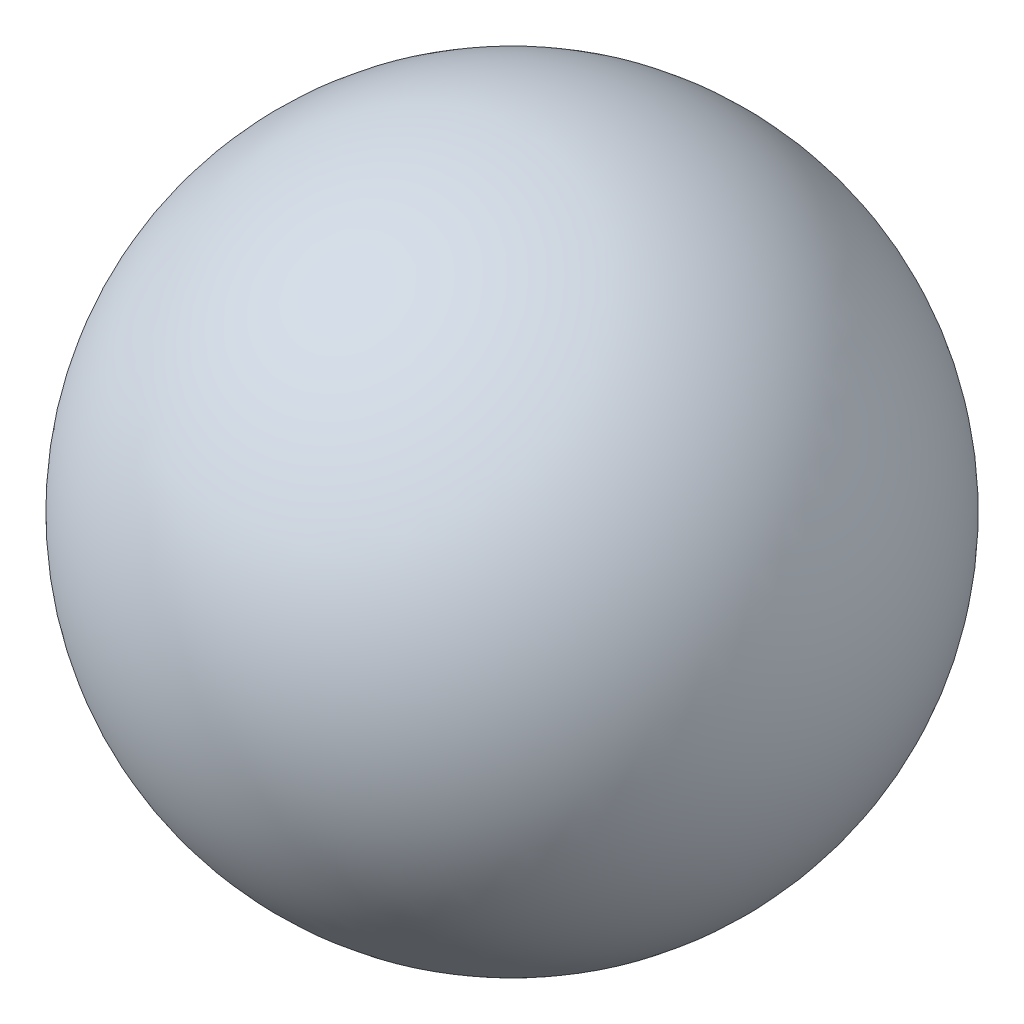
ISO-10303-21;
HEADER;
FILE_DESCRIPTION(('STEP AP214'),'2;1');
FILE_NAME('part.step','',(''),(''),'','','');
FILE_SCHEMA(('AUTOMOTIVE_DESIGN { 1 0 10303 214 1 1 1 1 }'));
ENDSEC;
DATA;
#1=APPLICATION_CONTEXT('core data for automotive mechanical design processes');
#2=APPLICATION_PROTOCOL_DEFINITION('international standard','automotive_design',2000,#1);
#3=PRODUCT_CONTEXT('',#1,'mechanical');
#4=PRODUCT('Part','Part','',(#3));
#5=PRODUCT_RELATED_PRODUCT_CATEGORY('part','',(#4));
#6=PRODUCT_DEFINITION_FORMATION('','',#4);
#7=PRODUCT_DEFINITION_CONTEXT('part definition',#1,'design');
#8=PRODUCT_DEFINITION('design','',#6,#7);
#9=PRODUCT_DEFINITION_SHAPE('','',#8);
#10=(LENGTH_UNIT() NAMED_UNIT(*) SI_UNIT(.MILLI.,.METRE.));
#11=(NAMED_UNIT(*) PLANE_ANGLE_UNIT() SI_UNIT($,.RADIAN.));
#12=(NAMED_UNIT(*) SI_UNIT($,.STERADIAN.) SOLID_ANGLE_UNIT());
#13=UNCERTAINTY_MEASURE_WITH_UNIT(LENGTH_MEASURE(1.E-05),#10,'distance_accuracy_value','');
#14=(GEOMETRIC_REPRESENTATION_CONTEXT(3) GLOBAL_UNCERTAINTY_ASSIGNED_CONTEXT((#13)) GLOBAL_UNIT_ASSIGNED_CONTEXT((#10,
#11,#12)) REPRESENTATION_CONTEXT('',''));
#15=CARTESIAN_POINT('',(0.,0.,0.));
#16=DIRECTION('',(0.,0.,1.));
#17=DIRECTION('',(1.,0.,0.));
#18=AXIS2_PLACEMENT_3D('',#15,#16,#17);
#19=CARTESIAN_POINT('',(0.,0.,0.));
#20=DIRECTION('',(0.,1.,0.));
#21=DIRECTION('',(1.,0.,0.));
#22=AXIS2_PLACEMENT_3D('',#19,#20,#21);
#23=SPHERICAL_SURFACE('',#22,2.75);
#24=CARTESIAN_POINT('',(0.,2.75,0.));
#25=VERTEX_POINT('',#24);
#26=VERTEX_LOOP('',#25);
#27=FACE_BOUND('',#26,.T.);
#28=ADVANCED_FACE('F35',(#27),#23,.T.);
#29=CLOSED_SHELL('',(#28));
#30=MANIFOLD_SOLID_BREP('B2',#29);
#31=ADVANCED_BREP_SHAPE_REPRESENTATION('',(#18,#30),#14);
#32=SHAPE_DEFINITION_REPRESENTATION(#9,#31);
ENDSEC;
END-ISO-10303-21;
